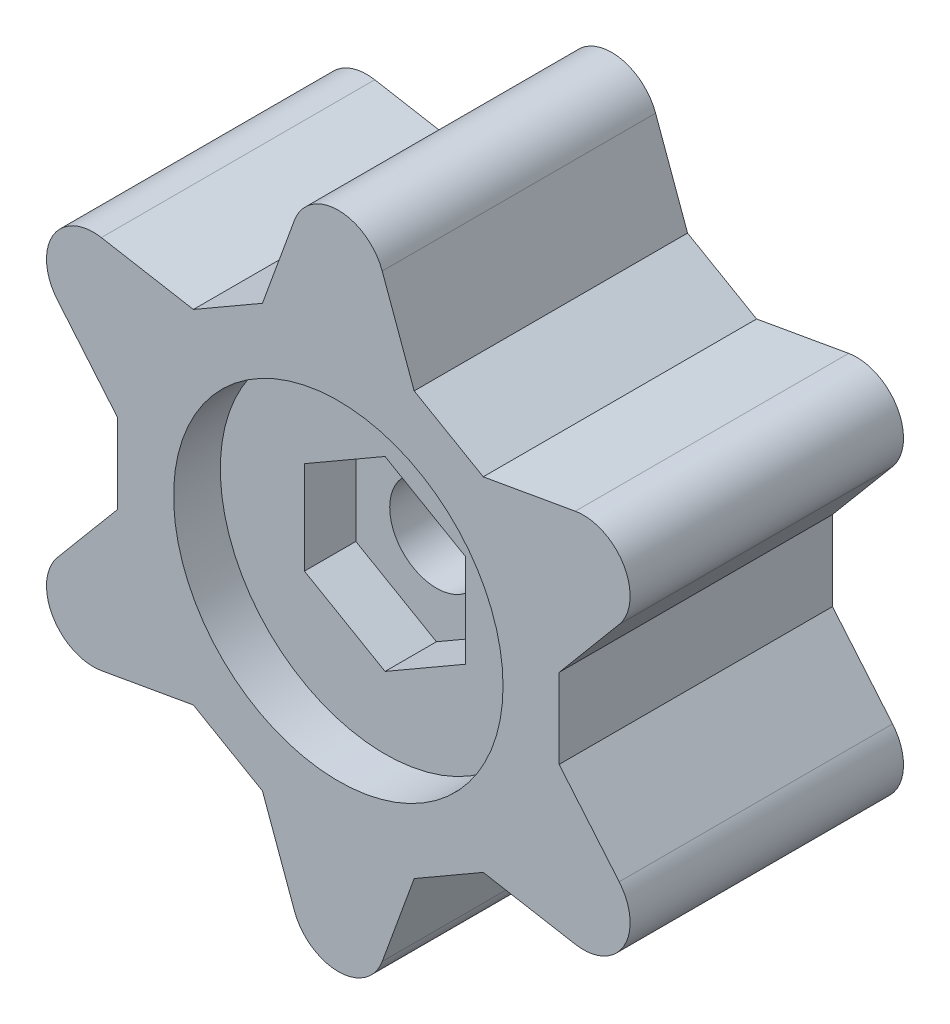
ISO-10303-21;
HEADER;
FILE_DESCRIPTION(('STEP AP214'),'2;1');
FILE_NAME('part.step','',(''),(''),'','','');
FILE_SCHEMA(('AUTOMOTIVE_DESIGN { 1 0 10303 214 1 1 1 1 }'));
ENDSEC;
DATA;
#1=APPLICATION_CONTEXT('core data for automotive mechanical design processes');
#2=APPLICATION_PROTOCOL_DEFINITION('international standard','automotive_design',2000,#1);
#3=PRODUCT_CONTEXT('',#1,'mechanical');
#4=PRODUCT('Part','Part','',(#3));
#5=PRODUCT_RELATED_PRODUCT_CATEGORY('part','',(#4));
#6=PRODUCT_DEFINITION_FORMATION('','',#4);
#7=PRODUCT_DEFINITION_CONTEXT('part definition',#1,'design');
#8=PRODUCT_DEFINITION('design','',#6,#7);
#9=PRODUCT_DEFINITION_SHAPE('','',#8);
#10=(LENGTH_UNIT() NAMED_UNIT(*) SI_UNIT(.MILLI.,.METRE.));
#11=(NAMED_UNIT(*) PLANE_ANGLE_UNIT() SI_UNIT($,.RADIAN.));
#12=(NAMED_UNIT(*) SI_UNIT($,.STERADIAN.) SOLID_ANGLE_UNIT());
#13=UNCERTAINTY_MEASURE_WITH_UNIT(LENGTH_MEASURE(1.E-05),#10,'distance_accuracy_value','');
#14=(GEOMETRIC_REPRESENTATION_CONTEXT(3) GLOBAL_UNCERTAINTY_ASSIGNED_CONTEXT((#13)) GLOBAL_UNIT_ASSIGNED_CONTEXT((#10,
#11,#12)) REPRESENTATION_CONTEXT('',''));
#15=CARTESIAN_POINT('',(0.,0.,0.));
#16=DIRECTION('',(0.,0.,1.));
#17=DIRECTION('',(1.,0.,0.));
#18=AXIS2_PLACEMENT_3D('',#15,#16,#17);
#19=CARTESIAN_POINT('',(0.,12.1117250217743,9.7));
#20=DIRECTION('',(0.,0.,-1.));
#21=DIRECTION('',(-1.,0.,0.));
#22=AXIS2_PLACEMENT_3D('',#19,#20,#21);
#23=PLANE('',#22);
#24=DIRECTION('',(0.866025403784439,0.5,0.));
#25=VECTOR('',#24,1.);
#26=CARTESIAN_POINT('',(0.,-3.98371685740842,9.7));
#27=LINE('',#26,#25);
#28=CARTESIAN_POINT('',(0.,-3.98371685740842,9.7));
#29=VERTEX_POINT('',#28);
#30=CARTESIAN_POINT('',(3.45,-1.99185842870421,9.7));
#31=VERTEX_POINT('',#30);
#32=EDGE_CURVE('E346',#29,#31,#27,.T.);
#33=ORIENTED_EDGE('',*,*,#32,.F.);
#34=DIRECTION('',(0.866025403784439,-0.5,0.));
#35=VECTOR('',#34,1.);
#36=CARTESIAN_POINT('',(-3.45,-1.99185842870421,9.7));
#37=LINE('',#36,#35);
#38=CARTESIAN_POINT('',(-3.45,-1.99185842870421,9.7));
#39=VERTEX_POINT('',#38);
#40=EDGE_CURVE('E357',#39,#29,#37,.T.);
#41=ORIENTED_EDGE('',*,*,#40,.F.);
#42=DIRECTION('',(0.,-1.,0.));
#43=VECTOR('',#42,1.);
#44=CARTESIAN_POINT('',(-3.45,1.99185842870421,9.7));
#45=LINE('',#44,#43);
#46=CARTESIAN_POINT('',(-3.45,1.99185842870421,9.7));
#47=VERTEX_POINT('',#46);
#48=EDGE_CURVE('E354',#47,#39,#45,.T.);
#49=ORIENTED_EDGE('',*,*,#48,.F.);
#50=DIRECTION('',(-0.866025403784439,-0.5,0.));
#51=VECTOR('',#50,1.);
#52=CARTESIAN_POINT('',(0.,3.98371685740842,9.7));
#53=LINE('',#52,#51);
#54=CARTESIAN_POINT('',(0.,3.98371685740842,9.7));
#55=VERTEX_POINT('',#54);
#56=EDGE_CURVE('E352',#55,#47,#53,.T.);
#57=ORIENTED_EDGE('',*,*,#56,.F.);
#58=DIRECTION('',(-0.866025403784439,0.5,0.));
#59=VECTOR('',#58,1.);
#60=CARTESIAN_POINT('',(3.45,1.99185842870421,9.7));
#61=LINE('',#60,#59);
#62=CARTESIAN_POINT('',(3.45,1.99185842870421,9.7));
#63=VERTEX_POINT('',#62);
#64=EDGE_CURVE('E350',#63,#55,#61,.T.);
#65=ORIENTED_EDGE('',*,*,#64,.F.);
#66=DIRECTION('',(0.,1.,0.));
#67=VECTOR('',#66,1.);
#68=CARTESIAN_POINT('',(3.45,-1.99185842870421,9.7));
#69=LINE('',#68,#67);
#70=EDGE_CURVE('E348',#31,#63,#69,.T.);
#71=ORIENTED_EDGE('',*,*,#70,.F.);
#72=EDGE_LOOP('',(#33,#41,#49,#57,#65,#71));
#73=FACE_BOUND('',#72,.T.);
#74=CARTESIAN_POINT('',(0.,0.,9.7));
#75=DIRECTION('',(0.,0.,1.));
#76=DIRECTION('',(1.,0.,0.));
#77=AXIS2_PLACEMENT_3D('',#74,#75,#76);
#78=CIRCLE('',#77,7.05);
#79=CARTESIAN_POINT('',(7.05,0.,9.7));
#80=VERTEX_POINT('',#79);
#81=EDGE_CURVE('E264',#80,#80,#78,.T.);
#82=ORIENTED_EDGE('',*,*,#81,.T.);
#83=EDGE_LOOP('',(#82));
#84=FACE_BOUND('',#83,.T.);
#85=ADVANCED_FACE('F35',(#73,#84),#23,.F.);
#86=CARTESIAN_POINT('',(0.,12.1117250217743,0.));
#87=DIRECTION('',(0.,0.,-1.));
#88=DIRECTION('',(-1.,0.,0.));
#89=AXIS2_PLACEMENT_3D('',#86,#87,#88);
#90=PLANE('',#89);
#91=DIRECTION('',(-0.866025403784439,-0.499999999999999,0.));
#92=VECTOR('',#91,1.);
#93=CARTESIAN_POINT('',(-6.20253418512551,7.33088530624386,0.));
#94=LINE('',#93,#92);
#95=CARTESIAN_POINT('',(-3.24746581487448,9.03699482528204,0.));
#96=VERTEX_POINT('',#95);
#97=CARTESIAN_POINT('',(-6.20253418512551,7.33088530624386,0.));
#98=VERTEX_POINT('',#97);
#99=EDGE_CURVE('E373',#96,#98,#94,.T.);
#100=ORIENTED_EDGE('',*,*,#99,.F.);
#101=DIRECTION('',(-0.342020143325666,-0.939692620785909,0.));
#102=VECTOR('',#101,1.);
#103=CARTESIAN_POINT('',(-3.24746581487448,9.03699482528204,0.));
#104=LINE('',#103,#102);
#105=CARTESIAN_POINT('',(-1.87938524157182,12.7957653084257,0.));
#106=VERTEX_POINT('',#105);
#107=EDGE_CURVE('E242',#106,#96,#104,.T.);
#108=ORIENTED_EDGE('',*,*,#107,.F.);
#109=CARTESIAN_POINT('',(0.,12.1117250217743,0.));
#110=DIRECTION('',(0.,0.,1.));
#111=DIRECTION('',(-1.,0.,0.));
#112=AXIS2_PLACEMENT_3D('',#109,#110,#111);
#113=CIRCLE('',#112,2.);
#114=CARTESIAN_POINT('',(1.87938524157182,12.7957653084257,0.));
#115=VERTEX_POINT('',#114);
#116=EDGE_CURVE('E417',#115,#106,#113,.T.);
#117=ORIENTED_EDGE('',*,*,#116,.F.);
#118=DIRECTION('',(-0.342020143325666,0.939692620785909,0.));
#119=VECTOR('',#118,1.);
#120=CARTESIAN_POINT('',(1.87938524157182,12.7957653084257,0.));
#121=LINE('',#120,#119);
#122=CARTESIAN_POINT('',(3.24746581487448,9.03699482528204,0.));
#123=VERTEX_POINT('',#122);
#124=EDGE_CURVE('E415',#123,#115,#121,.T.);
#125=ORIENTED_EDGE('',*,*,#124,.F.);
#126=DIRECTION('',(-0.866025403784439,0.5,0.));
#127=VECTOR('',#126,1.);
#128=CARTESIAN_POINT('',(3.24746581487448,9.03699482528204,0.));
#129=LINE('',#128,#127);
#130=CARTESIAN_POINT('',(6.20253418512552,7.33088530624386,0.));
#131=VERTEX_POINT('',#130);
#132=EDGE_CURVE('E413',#131,#123,#129,.T.);
#133=ORIENTED_EDGE('',*,*,#132,.F.);
#134=DIRECTION('',(-0.984807753012208,-0.173648177666933,0.));
#135=VECTOR('',#134,1.);
#136=CARTESIAN_POINT('',(6.20253418512552,7.33088530624386,0.));
#137=LINE('',#136,#135);
#138=CARTESIAN_POINT('',(10.1417651971744,8.02547801691159,0.));
#139=VERTEX_POINT('',#138);
#140=EDGE_CURVE('E411',#139,#131,#137,.T.);
#141=ORIENTED_EDGE('',*,*,#140,.F.);
#142=CARTESIAN_POINT('',(10.4890615525082,6.05586251088717,0.));
#143=DIRECTION('',(0.,0.,1.));
#144=DIRECTION('',(-1.,0.,0.));
#145=AXIS2_PLACEMENT_3D('',#142,#143,#144);
#146=CIRCLE('',#145,2.);
#147=CARTESIAN_POINT('',(12.0211504387462,4.77028729151409,0.));
#148=VERTEX_POINT('',#147);
#149=EDGE_CURVE('E409',#148,#139,#146,.T.);
#150=ORIENTED_EDGE('',*,*,#149,.F.);
#151=DIRECTION('',(0.642787609686542,0.766044443118976,0.));
#152=VECTOR('',#151,1.);
#153=CARTESIAN_POINT('',(12.0211504387462,4.77028729151409,0.));
#154=LINE('',#153,#152);
#155=CARTESIAN_POINT('',(9.45,1.70610951903819,0.));
#156=VERTEX_POINT('',#155);
#157=EDGE_CURVE('E407',#156,#148,#154,.T.);
#158=ORIENTED_EDGE('',*,*,#157,.F.);
#159=DIRECTION('',(0.,1.,0.));
#160=VECTOR('',#159,1.);
#161=CARTESIAN_POINT('',(9.45,1.70610951903819,0.));
#162=LINE('',#161,#160);
#163=CARTESIAN_POINT('',(9.45,-1.70610951903818,0.));
#164=VERTEX_POINT('',#163);
#165=EDGE_CURVE('E405',#164,#156,#162,.T.);
#166=ORIENTED_EDGE('',*,*,#165,.F.);
#167=DIRECTION('',(-0.642787609686541,0.766044443118977,0.));
#168=VECTOR('',#167,1.);
#169=CARTESIAN_POINT('',(9.45,-1.70610951903818,0.));
#170=LINE('',#169,#168);
#171=CARTESIAN_POINT('',(12.0211504387462,-4.77028729151409,0.));
#172=VERTEX_POINT('',#171);
#173=EDGE_CURVE('E403',#172,#164,#170,.T.);
#174=ORIENTED_EDGE('',*,*,#173,.F.);
#175=CARTESIAN_POINT('',(10.4890615525082,-6.05586251088718,0.));
#176=DIRECTION('',(0.,0.,1.));
#177=DIRECTION('',(-1.,0.,0.));
#178=AXIS2_PLACEMENT_3D('',#175,#176,#177);
#179=CIRCLE('',#178,2.);
#180=CARTESIAN_POINT('',(10.1417651971743,-8.02547801691159,0.));
#181=VERTEX_POINT('',#180);
#182=EDGE_CURVE('E401',#181,#172,#179,.T.);
#183=ORIENTED_EDGE('',*,*,#182,.F.);
#184=DIRECTION('',(0.984807753012207,-0.173648177666934,0.));
#185=VECTOR('',#184,1.);
#186=CARTESIAN_POINT('',(10.1417651971743,-8.02547801691159,0.));
#187=LINE('',#186,#185);
#188=CARTESIAN_POINT('',(6.20253418512552,-7.33088530624386,0.));
#189=VERTEX_POINT('',#188);
#190=EDGE_CURVE('E399',#189,#181,#187,.T.);
#191=ORIENTED_EDGE('',*,*,#190,.F.);
#192=DIRECTION('',(0.866025403784439,0.499999999999999,0.));
#193=VECTOR('',#192,1.);
#194=CARTESIAN_POINT('',(6.20253418512552,-7.33088530624386,0.));
#195=LINE('',#194,#193);
#196=CARTESIAN_POINT('',(3.24746581487448,-9.03699482528204,0.));
#197=VERTEX_POINT('',#196);
#198=EDGE_CURVE('E397',#197,#189,#195,.T.);
#199=ORIENTED_EDGE('',*,*,#198,.F.);
#200=DIRECTION('',(0.342020143325666,0.939692620785909,0.));
#201=VECTOR('',#200,1.);
#202=CARTESIAN_POINT('',(3.24746581487448,-9.03699482528204,0.));
#203=LINE('',#202,#201);
#204=CARTESIAN_POINT('',(1.87938524157181,-12.7957653084257,0.));
#205=VERTEX_POINT('',#204);
#206=EDGE_CURVE('E395',#205,#197,#203,.T.);
#207=ORIENTED_EDGE('',*,*,#206,.F.);
#208=CARTESIAN_POINT('',(0.,-12.1117250217743,0.));
#209=DIRECTION('',(0.,0.,1.));
#210=DIRECTION('',(-1.,0.,0.));
#211=AXIS2_PLACEMENT_3D('',#208,#209,#210);
#212=CIRCLE('',#211,2.);
#213=CARTESIAN_POINT('',(-1.87938524157183,-12.7957653084257,0.));
#214=VERTEX_POINT('',#213);
#215=EDGE_CURVE('E393',#214,#205,#212,.T.);
#216=ORIENTED_EDGE('',*,*,#215,.F.);
#217=DIRECTION('',(0.342020143325665,-0.93969262078591,0.));
#218=VECTOR('',#217,1.);
#219=CARTESIAN_POINT('',(-1.87938524157183,-12.7957653084257,0.));
#220=LINE('',#219,#218);
#221=CARTESIAN_POINT('',(-3.24746581487449,-9.03699482528204,0.));
#222=VERTEX_POINT('',#221);
#223=EDGE_CURVE('E391',#222,#214,#220,.T.);
#224=ORIENTED_EDGE('',*,*,#223,.F.);
#225=DIRECTION('',(0.866025403784438,-0.500000000000001,0.));
#226=VECTOR('',#225,1.);
#227=CARTESIAN_POINT('',(-3.24746581487449,-9.03699482528204,0.));
#228=LINE('',#227,#226);
#229=CARTESIAN_POINT('',(-6.20253418512552,-7.33088530624385,0.));
#230=VERTEX_POINT('',#229);
#231=EDGE_CURVE('E389',#230,#222,#228,.T.);
#232=ORIENTED_EDGE('',*,*,#231,.F.);
#233=DIRECTION('',(0.984807753012208,0.173648177666933,0.));
#234=VECTOR('',#233,1.);
#235=CARTESIAN_POINT('',(-6.20253418512552,-7.33088530624385,0.));
#236=LINE('',#235,#234);
#237=CARTESIAN_POINT('',(-10.1417651971744,-8.02547801691158,0.));
#238=VERTEX_POINT('',#237);
#239=EDGE_CURVE('E387',#238,#230,#236,.T.);
#240=ORIENTED_EDGE('',*,*,#239,.F.);
#241=CARTESIAN_POINT('',(-10.4890615525082,-6.05586251088717,0.));
#242=DIRECTION('',(0.,0.,1.));
#243=DIRECTION('',(-1.,0.,0.));
#244=AXIS2_PLACEMENT_3D('',#241,#242,#243);
#245=CIRCLE('',#244,2.);
#246=CARTESIAN_POINT('',(-12.0211504387462,-4.77028729151409,0.));
#247=VERTEX_POINT('',#246);
#248=EDGE_CURVE('E385',#247,#238,#245,.T.);
#249=ORIENTED_EDGE('',*,*,#248,.F.);
#250=DIRECTION('',(-0.642787609686543,-0.766044443118975,0.));
#251=VECTOR('',#250,1.);
#252=CARTESIAN_POINT('',(-12.0211504387462,-4.77028729151409,0.));
#253=LINE('',#252,#251);
#254=CARTESIAN_POINT('',(-9.45,-1.70610951903819,0.));
#255=VERTEX_POINT('',#254);
#256=EDGE_CURVE('E383',#255,#247,#253,.T.);
#257=ORIENTED_EDGE('',*,*,#256,.F.);
#258=DIRECTION('',(0.,-1.,0.));
#259=VECTOR('',#258,1.);
#260=CARTESIAN_POINT('',(-9.45,-1.70610951903819,0.));
#261=LINE('',#260,#259);
#262=CARTESIAN_POINT('',(-9.45,1.70610951903819,0.));
#263=VERTEX_POINT('',#262);
#264=EDGE_CURVE('E381',#263,#255,#261,.T.);
#265=ORIENTED_EDGE('',*,*,#264,.F.);
#266=DIRECTION('',(0.642787609686539,-0.766044443118978,0.));
#267=VECTOR('',#266,1.);
#268=CARTESIAN_POINT('',(-9.45,1.70610951903819,0.));
#269=LINE('',#268,#267);
#270=CARTESIAN_POINT('',(-12.0211504387462,4.7702872915141,0.));
#271=VERTEX_POINT('',#270);
#272=EDGE_CURVE('E379',#271,#263,#269,.T.);
#273=ORIENTED_EDGE('',*,*,#272,.F.);
#274=CARTESIAN_POINT('',(-10.4890615525082,6.05586251088719,0.));
#275=DIRECTION('',(0.,0.,1.));
#276=DIRECTION('',(-1.,0.,0.));
#277=AXIS2_PLACEMENT_3D('',#274,#275,#276);
#278=CIRCLE('',#277,2.);
#279=CARTESIAN_POINT('',(-10.1417651971743,8.0254780169116,0.));
#280=VERTEX_POINT('',#279);
#281=EDGE_CURVE('E377',#280,#271,#278,.T.);
#282=ORIENTED_EDGE('',*,*,#281,.F.);
#283=DIRECTION('',(-0.984807753012207,0.173648177666934,0.));
#284=VECTOR('',#283,1.);
#285=CARTESIAN_POINT('',(-10.1417651971743,8.0254780169116,0.));
#286=LINE('',#285,#284);
#287=EDGE_CURVE('E375',#98,#280,#286,.T.);
#288=ORIENTED_EDGE('',*,*,#287,.F.);
#289=EDGE_LOOP('',(#100,#108,#117,#125,#133,#141,#150,#158,#166,#174,#183,#191,#199,#207,#216,
#224,#232,#240,#249,#257,#265,#273,#282,#288));
#290=FACE_BOUND('',#289,.T.);
#291=CARTESIAN_POINT('',(0.,0.,0.));
#292=DIRECTION('',(0.,0.,-1.));
#293=DIRECTION('',(-1.,0.,0.));
#294=AXIS2_PLACEMENT_3D('',#291,#292,#293);
#295=CIRCLE('',#294,2.);
#296=CARTESIAN_POINT('',(-2.,0.,0.));
#297=VERTEX_POINT('',#296);
#298=EDGE_CURVE('E329',#297,#297,#295,.T.);
#299=ORIENTED_EDGE('',*,*,#298,.F.);
#300=EDGE_LOOP('',(#299));
#301=FACE_BOUND('',#300,.T.);
#302=ADVANCED_FACE('F488',(#290,#301),#90,.T.);
#303=CARTESIAN_POINT('',(-6.20253418512551,7.33088530624386,9.7));
#304=DIRECTION('',(0.499999999999999,-0.866025403784439,0.));
#305=DIRECTION('',(0.866025403784439,0.499999999999999,0.));
#306=AXIS2_PLACEMENT_3D('',#303,#304,#305);
#307=PLANE('',#306);
#308=ORIENTED_EDGE('',*,*,#99,.T.);
#309=DIRECTION('',(0.,0.,-1.));
#310=VECTOR('',#309,1.);
#311=CARTESIAN_POINT('',(-6.20253418512551,7.33088530624386,9.7));
#312=LINE('',#311,#310);
#313=CARTESIAN_POINT('',(-6.20253418512551,7.33088530624386,11.7));
#314=VERTEX_POINT('',#313);
#315=EDGE_CURVE('E11',#314,#98,#312,.T.);
#316=ORIENTED_EDGE('',*,*,#315,.F.);
#317=DIRECTION('',(-0.866025403784439,-0.499999999999999,0.));
#318=VECTOR('',#317,1.);
#319=CARTESIAN_POINT('',(-3.24746581487448,9.03699482528204,11.7));
#320=LINE('',#319,#318);
#321=CARTESIAN_POINT('',(-3.24746581487448,9.03699482528204,11.7));
#322=VERTEX_POINT('',#321);
#323=EDGE_CURVE('E249',#322,#314,#320,.T.);
#324=ORIENTED_EDGE('',*,*,#323,.F.);
#325=DIRECTION('',(0.,0.,-1.));
#326=VECTOR('',#325,1.);
#327=CARTESIAN_POINT('',(-3.24746581487448,9.03699482528204,9.7));
#328=LINE('',#327,#326);
#329=EDGE_CURVE('E235',#322,#96,#328,.T.);
#330=ORIENTED_EDGE('',*,*,#329,.T.);
#331=EDGE_LOOP('',(#308,#316,#324,#330));
#332=FACE_BOUND('',#331,.T.);
#333=ADVANCED_FACE('F37',(#332),#307,.F.);
#334=CARTESIAN_POINT('',(-10.1417651971743,8.0254780169116,9.7));
#335=DIRECTION('',(-0.173648177666934,-0.984807753012207,0.));
#336=DIRECTION('',(0.984807753012207,-0.173648177666934,0.));
#337=AXIS2_PLACEMENT_3D('',#334,#335,#336);
#338=PLANE('',#337);
#339=ORIENTED_EDGE('',*,*,#287,.T.);
#340=DIRECTION('',(0.,0.,-1.));
#341=VECTOR('',#340,1.);
#342=CARTESIAN_POINT('',(-10.1417651971743,8.0254780169116,9.7));
#343=LINE('',#342,#341);
#344=CARTESIAN_POINT('',(-10.1417651971743,8.0254780169116,11.7));
#345=VERTEX_POINT('',#344);
#346=EDGE_CURVE('E43',#345,#280,#343,.T.);
#347=ORIENTED_EDGE('',*,*,#346,.F.);
#348=DIRECTION('',(-0.984807753012207,0.173648177666934,0.));
#349=VECTOR('',#348,1.);
#350=CARTESIAN_POINT('',(-6.20253418512551,7.33088530624386,11.7));
#351=LINE('',#350,#349);
#352=EDGE_CURVE('E253',#314,#345,#351,.T.);
#353=ORIENTED_EDGE('',*,*,#352,.F.);
#354=ORIENTED_EDGE('',*,*,#315,.T.);
#355=EDGE_LOOP('',(#339,#347,#353,#354));
#356=FACE_BOUND('',#355,.T.);
#357=ADVANCED_FACE('F852',(#356),#338,.F.);
#358=CARTESIAN_POINT('',(-10.4890615525082,6.05586251088719,9.7));
#359=DIRECTION('',(0.,0.,-1.));
#360=DIRECTION('',(-1.,0.,0.));
#361=AXIS2_PLACEMENT_3D('',#358,#359,#360);
#362=CYLINDRICAL_SURFACE('',#361,2.);
#363=ORIENTED_EDGE('',*,*,#281,.T.);
#364=DIRECTION('',(0.,0.,-1.));
#365=VECTOR('',#364,1.);
#366=CARTESIAN_POINT('',(-12.0211504387462,4.7702872915141,9.7));
#367=LINE('',#366,#365);
#368=CARTESIAN_POINT('',(-12.0211504387462,4.77028729151411,11.7));
#369=VERTEX_POINT('',#368);
#370=EDGE_CURVE('E478',#369,#271,#367,.T.);
#371=ORIENTED_EDGE('',*,*,#370,.F.);
#372=CARTESIAN_POINT('',(-10.4890615525082,6.05586251088719,11.7));
#373=DIRECTION('',(0.,0.,1.));
#374=DIRECTION('',(1.,0.,0.));
#375=AXIS2_PLACEMENT_3D('',#372,#373,#374);
#376=CIRCLE('',#375,2.);
#377=EDGE_CURVE('E269',#345,#369,#376,.T.);
#378=ORIENTED_EDGE('',*,*,#377,.F.);
#379=ORIENTED_EDGE('',*,*,#346,.T.);
#380=EDGE_LOOP('',(#363,#371,#378,#379));
#381=FACE_BOUND('',#380,.T.);
#382=ADVANCED_FACE('F484',(#381),#362,.T.);
#383=CARTESIAN_POINT('',(-9.45,1.70610951903819,9.7));
#384=DIRECTION('',(0.766044443118978,0.642787609686539,0.));
#385=DIRECTION('',(-0.642787609686539,0.766044443118978,0.));
#386=AXIS2_PLACEMENT_3D('',#383,#384,#385);
#387=PLANE('',#386);
#388=ORIENTED_EDGE('',*,*,#272,.T.);
#389=DIRECTION('',(0.,0.,-1.));
#390=VECTOR('',#389,1.);
#391=CARTESIAN_POINT('',(-9.45,1.70610951903819,9.7));
#392=LINE('',#391,#390);
#393=CARTESIAN_POINT('',(-9.45,1.70610951903819,11.7));
#394=VERTEX_POINT('',#393);
#395=EDGE_CURVE('E475',#394,#263,#392,.T.);
#396=ORIENTED_EDGE('',*,*,#395,.F.);
#397=DIRECTION('',(0.642787609686539,-0.766044443118978,0.));
#398=VECTOR('',#397,1.);
#399=CARTESIAN_POINT('',(-12.0211504387462,4.77028729151411,11.7));
#400=LINE('',#399,#398);
#401=EDGE_CURVE('E272',#369,#394,#400,.T.);
#402=ORIENTED_EDGE('',*,*,#401,.F.);
#403=ORIENTED_EDGE('',*,*,#370,.T.);
#404=EDGE_LOOP('',(#388,#396,#402,#403));
#405=FACE_BOUND('',#404,.T.);
#406=ADVANCED_FACE('F493',(#405),#387,.F.);
#407=CARTESIAN_POINT('',(-9.45,-1.70610951903819,9.7));
#408=DIRECTION('',(1.,0.,0.));
#409=DIRECTION('',(0.,0.,-1.));
#410=AXIS2_PLACEMENT_3D('',#407,#408,#409);
#411=PLANE('',#410);
#412=ORIENTED_EDGE('',*,*,#264,.T.);
#413=DIRECTION('',(0.,0.,-1.));
#414=VECTOR('',#413,1.);
#415=CARTESIAN_POINT('',(-9.45,-1.70610951903819,9.7));
#416=LINE('',#415,#414);
#417=CARTESIAN_POINT('',(-9.45,-1.70610951903819,11.7));
#418=VERTEX_POINT('',#417);
#419=EDGE_CURVE('E472',#418,#255,#416,.T.);
#420=ORIENTED_EDGE('',*,*,#419,.F.);
#421=DIRECTION('',(0.,-1.,0.));
#422=VECTOR('',#421,1.);
#423=CARTESIAN_POINT('',(-9.45,1.70610951903819,11.7));
#424=LINE('',#423,#422);
#425=EDGE_CURVE('E275',#394,#418,#424,.T.);
#426=ORIENTED_EDGE('',*,*,#425,.F.);
#427=ORIENTED_EDGE('',*,*,#395,.T.);
#428=EDGE_LOOP('',(#412,#420,#426,#427));
#429=FACE_BOUND('',#428,.T.);
#430=ADVANCED_FACE('F497',(#429),#411,.F.);
#431=CARTESIAN_POINT('',(-12.0211504387462,-4.77028729151409,9.7));
#432=DIRECTION('',(0.766044443118975,-0.642787609686543,0.));
#433=DIRECTION('',(0.642787609686543,0.766044443118975,0.));
#434=AXIS2_PLACEMENT_3D('',#431,#432,#433);
#435=PLANE('',#434);
#436=ORIENTED_EDGE('',*,*,#256,.T.);
#437=DIRECTION('',(0.,0.,-1.));
#438=VECTOR('',#437,1.);
#439=CARTESIAN_POINT('',(-12.0211504387462,-4.77028729151409,9.7));
#440=LINE('',#439,#438);
#441=CARTESIAN_POINT('',(-12.0211504387462,-4.77028729151409,11.7));
#442=VERTEX_POINT('',#441);
#443=EDGE_CURVE('E469',#442,#247,#440,.T.);
#444=ORIENTED_EDGE('',*,*,#443,.F.);
#445=DIRECTION('',(-0.642787609686543,-0.766044443118975,0.));
#446=VECTOR('',#445,1.);
#447=CARTESIAN_POINT('',(-9.45,-1.70610951903819,11.7));
#448=LINE('',#447,#446);
#449=EDGE_CURVE('E278',#418,#442,#448,.T.);
#450=ORIENTED_EDGE('',*,*,#449,.F.);
#451=ORIENTED_EDGE('',*,*,#419,.T.);
#452=EDGE_LOOP('',(#436,#444,#450,#451));
#453=FACE_BOUND('',#452,.T.);
#454=ADVANCED_FACE('F501',(#453),#435,.F.);
#455=CARTESIAN_POINT('',(-10.4890615525082,-6.05586251088717,9.7));
#456=DIRECTION('',(0.,0.,-1.));
#457=DIRECTION('',(-1.,0.,0.));
#458=AXIS2_PLACEMENT_3D('',#455,#456,#457);
#459=CYLINDRICAL_SURFACE('',#458,2.);
#460=ORIENTED_EDGE('',*,*,#248,.T.);
#461=DIRECTION('',(0.,0.,-1.));
#462=VECTOR('',#461,1.);
#463=CARTESIAN_POINT('',(-10.1417651971744,-8.02547801691158,9.7));
#464=LINE('',#463,#462);
#465=CARTESIAN_POINT('',(-10.1417651971744,-8.02547801691158,11.7));
#466=VERTEX_POINT('',#465);
#467=EDGE_CURVE('E466',#466,#238,#464,.T.);
#468=ORIENTED_EDGE('',*,*,#467,.F.);
#469=CARTESIAN_POINT('',(-10.4890615525082,-6.05586251088717,11.7));
#470=DIRECTION('',(0.,0.,1.));
#471=DIRECTION('',(1.,0.,0.));
#472=AXIS2_PLACEMENT_3D('',#469,#470,#471);
#473=CIRCLE('',#472,2.);
#474=EDGE_CURVE('E281',#442,#466,#473,.T.);
#475=ORIENTED_EDGE('',*,*,#474,.F.);
#476=ORIENTED_EDGE('',*,*,#443,.T.);
#477=EDGE_LOOP('',(#460,#468,#475,#476));
#478=FACE_BOUND('',#477,.T.);
#479=ADVANCED_FACE('F504',(#478),#459,.T.);
#480=CARTESIAN_POINT('',(-6.20253418512552,-7.33088530624385,9.7));
#481=DIRECTION('',(-0.173648177666933,0.984807753012208,0.));
#482=DIRECTION('',(-0.984807753012208,-0.173648177666933,0.));
#483=AXIS2_PLACEMENT_3D('',#480,#481,#482);
#484=PLANE('',#483);
#485=ORIENTED_EDGE('',*,*,#239,.T.);
#486=DIRECTION('',(0.,0.,-1.));
#487=VECTOR('',#486,1.);
#488=CARTESIAN_POINT('',(-6.20253418512552,-7.33088530624385,9.7));
#489=LINE('',#488,#487);
#490=CARTESIAN_POINT('',(-6.20253418512552,-7.33088530624385,11.7));
#491=VERTEX_POINT('',#490);
#492=EDGE_CURVE('E463',#491,#230,#489,.T.);
#493=ORIENTED_EDGE('',*,*,#492,.F.);
#494=DIRECTION('',(0.984807753012208,0.173648177666933,0.));
#495=VECTOR('',#494,1.);
#496=CARTESIAN_POINT('',(-10.1417651971744,-8.02547801691158,11.7));
#497=LINE('',#496,#495);
#498=EDGE_CURVE('E284',#466,#491,#497,.T.);
#499=ORIENTED_EDGE('',*,*,#498,.F.);
#500=ORIENTED_EDGE('',*,*,#467,.T.);
#501=EDGE_LOOP('',(#485,#493,#499,#500));
#502=FACE_BOUND('',#501,.T.);
#503=ADVANCED_FACE('F509',(#502),#484,.F.);
#504=CARTESIAN_POINT('',(-3.24746581487449,-9.03699482528204,9.7));
#505=DIRECTION('',(0.500000000000001,0.866025403784438,0.));
#506=DIRECTION('',(-0.866025403784438,0.500000000000001,0.));
#507=AXIS2_PLACEMENT_3D('',#504,#505,#506);
#508=PLANE('',#507);
#509=ORIENTED_EDGE('',*,*,#231,.T.);
#510=DIRECTION('',(0.,0.,-1.));
#511=VECTOR('',#510,1.);
#512=CARTESIAN_POINT('',(-3.24746581487449,-9.03699482528204,9.7));
#513=LINE('',#512,#511);
#514=CARTESIAN_POINT('',(-3.24746581487449,-9.03699482528204,11.7));
#515=VERTEX_POINT('',#514);
#516=EDGE_CURVE('E460',#515,#222,#513,.T.);
#517=ORIENTED_EDGE('',*,*,#516,.F.);
#518=DIRECTION('',(0.866025403784438,-0.500000000000001,0.));
#519=VECTOR('',#518,1.);
#520=CARTESIAN_POINT('',(-6.20253418512552,-7.33088530624385,11.7));
#521=LINE('',#520,#519);
#522=EDGE_CURVE('E287',#491,#515,#521,.T.);
#523=ORIENTED_EDGE('',*,*,#522,.F.);
#524=ORIENTED_EDGE('',*,*,#492,.T.);
#525=EDGE_LOOP('',(#509,#517,#523,#524));
#526=FACE_BOUND('',#525,.T.);
#527=ADVANCED_FACE('F513',(#526),#508,.F.);
#528=CARTESIAN_POINT('',(-1.87938524157183,-12.7957653084257,9.7));
#529=DIRECTION('',(0.93969262078591,0.342020143325665,0.));
#530=DIRECTION('',(-0.342020143325665,0.93969262078591,0.));
#531=AXIS2_PLACEMENT_3D('',#528,#529,#530);
#532=PLANE('',#531);
#533=ORIENTED_EDGE('',*,*,#223,.T.);
#534=DIRECTION('',(0.,0.,-1.));
#535=VECTOR('',#534,1.);
#536=CARTESIAN_POINT('',(-1.87938524157183,-12.7957653084257,9.7));
#537=LINE('',#536,#535);
#538=CARTESIAN_POINT('',(-1.87938524157183,-12.7957653084257,11.7));
#539=VERTEX_POINT('',#538);
#540=EDGE_CURVE('E457',#539,#214,#537,.T.);
#541=ORIENTED_EDGE('',*,*,#540,.F.);
#542=DIRECTION('',(0.342020143325665,-0.93969262078591,0.));
#543=VECTOR('',#542,1.);
#544=CARTESIAN_POINT('',(-3.24746581487449,-9.03699482528204,11.7));
#545=LINE('',#544,#543);
#546=EDGE_CURVE('E290',#515,#539,#545,.T.);
#547=ORIENTED_EDGE('',*,*,#546,.F.);
#548=ORIENTED_EDGE('',*,*,#516,.T.);
#549=EDGE_LOOP('',(#533,#541,#547,#548));
#550=FACE_BOUND('',#549,.T.);
#551=ADVANCED_FACE('F517',(#550),#532,.F.);
#552=CARTESIAN_POINT('',(0.,-12.1117250217743,9.7));
#553=DIRECTION('',(0.,0.,-1.));
#554=DIRECTION('',(-1.,0.,0.));
#555=AXIS2_PLACEMENT_3D('',#552,#553,#554);
#556=CYLINDRICAL_SURFACE('',#555,2.);
#557=ORIENTED_EDGE('',*,*,#215,.T.);
#558=DIRECTION('',(0.,0.,-1.));
#559=VECTOR('',#558,1.);
#560=CARTESIAN_POINT('',(1.87938524157181,-12.7957653084257,9.7));
#561=LINE('',#560,#559);
#562=CARTESIAN_POINT('',(1.87938524157181,-12.7957653084257,11.7));
#563=VERTEX_POINT('',#562);
#564=EDGE_CURVE('E454',#563,#205,#561,.T.);
#565=ORIENTED_EDGE('',*,*,#564,.F.);
#566=CARTESIAN_POINT('',(0.,-12.1117250217743,11.7));
#567=DIRECTION('',(0.,0.,1.));
#568=DIRECTION('',(1.,0.,0.));
#569=AXIS2_PLACEMENT_3D('',#566,#567,#568);
#570=CIRCLE('',#569,2.);
#571=EDGE_CURVE('E293',#539,#563,#570,.T.);
#572=ORIENTED_EDGE('',*,*,#571,.F.);
#573=ORIENTED_EDGE('',*,*,#540,.T.);
#574=EDGE_LOOP('',(#557,#565,#572,#573));
#575=FACE_BOUND('',#574,.T.);
#576=ADVANCED_FACE('F520',(#575),#556,.T.);
#577=CARTESIAN_POINT('',(3.24746581487448,-9.03699482528204,9.7));
#578=DIRECTION('',(-0.939692620785909,0.342020143325666,0.));
#579=DIRECTION('',(-0.342020143325666,-0.939692620785909,0.));
#580=AXIS2_PLACEMENT_3D('',#577,#578,#579);
#581=PLANE('',#580);
#582=ORIENTED_EDGE('',*,*,#206,.T.);
#583=DIRECTION('',(0.,0.,-1.));
#584=VECTOR('',#583,1.);
#585=CARTESIAN_POINT('',(3.24746581487448,-9.03699482528204,9.7));
#586=LINE('',#585,#584);
#587=CARTESIAN_POINT('',(3.24746581487448,-9.03699482528204,11.7));
#588=VERTEX_POINT('',#587);
#589=EDGE_CURVE('E451',#588,#197,#586,.T.);
#590=ORIENTED_EDGE('',*,*,#589,.F.);
#591=DIRECTION('',(0.342020143325666,0.939692620785909,0.));
#592=VECTOR('',#591,1.);
#593=CARTESIAN_POINT('',(1.87938524157181,-12.7957653084257,11.7));
#594=LINE('',#593,#592);
#595=EDGE_CURVE('E296',#563,#588,#594,.T.);
#596=ORIENTED_EDGE('',*,*,#595,.F.);
#597=ORIENTED_EDGE('',*,*,#564,.T.);
#598=EDGE_LOOP('',(#582,#590,#596,#597));
#599=FACE_BOUND('',#598,.T.);
#600=ADVANCED_FACE('F525',(#599),#581,.F.);
#601=CARTESIAN_POINT('',(6.20253418512552,-7.33088530624386,9.7));
#602=DIRECTION('',(-0.499999999999999,0.866025403784439,0.));
#603=DIRECTION('',(-0.866025403784439,-0.499999999999999,0.));
#604=AXIS2_PLACEMENT_3D('',#601,#602,#603);
#605=PLANE('',#604);
#606=ORIENTED_EDGE('',*,*,#198,.T.);
#607=DIRECTION('',(0.,0.,-1.));
#608=VECTOR('',#607,1.);
#609=CARTESIAN_POINT('',(6.20253418512552,-7.33088530624386,9.7));
#610=LINE('',#609,#608);
#611=CARTESIAN_POINT('',(6.20253418512552,-7.33088530624386,11.7));
#612=VERTEX_POINT('',#611);
#613=EDGE_CURVE('E448',#612,#189,#610,.T.);
#614=ORIENTED_EDGE('',*,*,#613,.F.);
#615=DIRECTION('',(0.866025403784439,0.499999999999999,0.));
#616=VECTOR('',#615,1.);
#617=CARTESIAN_POINT('',(3.24746581487448,-9.03699482528204,11.7));
#618=LINE('',#617,#616);
#619=EDGE_CURVE('E299',#588,#612,#618,.T.);
#620=ORIENTED_EDGE('',*,*,#619,.F.);
#621=ORIENTED_EDGE('',*,*,#589,.T.);
#622=EDGE_LOOP('',(#606,#614,#620,#621));
#623=FACE_BOUND('',#622,.T.);
#624=ADVANCED_FACE('F529',(#623),#605,.F.);
#625=CARTESIAN_POINT('',(10.1417651971743,-8.02547801691159,9.7));
#626=DIRECTION('',(0.173648177666934,0.984807753012208,0.));
#627=DIRECTION('',(-0.984807753012208,0.173648177666934,0.));
#628=AXIS2_PLACEMENT_3D('',#625,#626,#627);
#629=PLANE('',#628);
#630=ORIENTED_EDGE('',*,*,#190,.T.);
#631=DIRECTION('',(0.,0.,-1.));
#632=VECTOR('',#631,1.);
#633=CARTESIAN_POINT('',(10.1417651971743,-8.02547801691159,9.7));
#634=LINE('',#633,#632);
#635=CARTESIAN_POINT('',(10.1417651971743,-8.02547801691159,11.7));
#636=VERTEX_POINT('',#635);
#637=EDGE_CURVE('E445',#636,#181,#634,.T.);
#638=ORIENTED_EDGE('',*,*,#637,.F.);
#639=DIRECTION('',(0.984807753012207,-0.173648177666934,0.));
#640=VECTOR('',#639,1.);
#641=CARTESIAN_POINT('',(6.20253418512552,-7.33088530624386,11.7));
#642=LINE('',#641,#640);
#643=EDGE_CURVE('E302',#612,#636,#642,.T.);
#644=ORIENTED_EDGE('',*,*,#643,.F.);
#645=ORIENTED_EDGE('',*,*,#613,.T.);
#646=EDGE_LOOP('',(#630,#638,#644,#645));
#647=FACE_BOUND('',#646,.T.);
#648=ADVANCED_FACE('F533',(#647),#629,.F.);
#649=CARTESIAN_POINT('',(10.4890615525082,-6.05586251088718,9.7));
#650=DIRECTION('',(0.,0.,-1.));
#651=DIRECTION('',(-1.,0.,0.));
#652=AXIS2_PLACEMENT_3D('',#649,#650,#651);
#653=CYLINDRICAL_SURFACE('',#652,2.);
#654=ORIENTED_EDGE('',*,*,#182,.T.);
#655=DIRECTION('',(0.,0.,-1.));
#656=VECTOR('',#655,1.);
#657=CARTESIAN_POINT('',(12.0211504387462,-4.77028729151409,9.7));
#658=LINE('',#657,#656);
#659=CARTESIAN_POINT('',(12.0211504387462,-4.77028729151409,11.7));
#660=VERTEX_POINT('',#659);
#661=EDGE_CURVE('E442',#660,#172,#658,.T.);
#662=ORIENTED_EDGE('',*,*,#661,.F.);
#663=CARTESIAN_POINT('',(10.4890615525082,-6.05586251088718,11.7));
#664=DIRECTION('',(0.,0.,1.));
#665=DIRECTION('',(1.,0.,0.));
#666=AXIS2_PLACEMENT_3D('',#663,#664,#665);
#667=CIRCLE('',#666,2.);
#668=EDGE_CURVE('E305',#636,#660,#667,.T.);
#669=ORIENTED_EDGE('',*,*,#668,.F.);
#670=ORIENTED_EDGE('',*,*,#637,.T.);
#671=EDGE_LOOP('',(#654,#662,#669,#670));
#672=FACE_BOUND('',#671,.T.);
#673=ADVANCED_FACE('F536',(#672),#653,.T.);
#674=CARTESIAN_POINT('',(9.45,-1.70610951903818,9.7));
#675=DIRECTION('',(-0.766044443118977,-0.642787609686541,0.));
#676=DIRECTION('',(0.642787609686541,-0.766044443118976,0.));
#677=AXIS2_PLACEMENT_3D('',#674,#675,#676);
#678=PLANE('',#677);
#679=ORIENTED_EDGE('',*,*,#173,.T.);
#680=DIRECTION('',(0.,0.,-1.));
#681=VECTOR('',#680,1.);
#682=CARTESIAN_POINT('',(9.45,-1.70610951903818,9.7));
#683=LINE('',#682,#681);
#684=CARTESIAN_POINT('',(9.45,-1.70610951903818,11.7));
#685=VERTEX_POINT('',#684);
#686=EDGE_CURVE('E439',#685,#164,#683,.T.);
#687=ORIENTED_EDGE('',*,*,#686,.F.);
#688=DIRECTION('',(-0.642787609686541,0.766044443118977,0.));
#689=VECTOR('',#688,1.);
#690=CARTESIAN_POINT('',(12.0211504387462,-4.77028729151409,11.7));
#691=LINE('',#690,#689);
#692=EDGE_CURVE('E308',#660,#685,#691,.T.);
#693=ORIENTED_EDGE('',*,*,#692,.F.);
#694=ORIENTED_EDGE('',*,*,#661,.T.);
#695=EDGE_LOOP('',(#679,#687,#693,#694));
#696=FACE_BOUND('',#695,.T.);
#697=ADVANCED_FACE('F541',(#696),#678,.F.);
#698=CARTESIAN_POINT('',(9.45,1.70610951903819,9.7));
#699=DIRECTION('',(-1.,0.,0.));
#700=DIRECTION('',(0.,0.,1.));
#701=AXIS2_PLACEMENT_3D('',#698,#699,#700);
#702=PLANE('',#701);
#703=ORIENTED_EDGE('',*,*,#165,.T.);
#704=DIRECTION('',(0.,0.,-1.));
#705=VECTOR('',#704,1.);
#706=CARTESIAN_POINT('',(9.45,1.70610951903819,9.7));
#707=LINE('',#706,#705);
#708=CARTESIAN_POINT('',(9.45,1.70610951903819,11.7));
#709=VERTEX_POINT('',#708);
#710=EDGE_CURVE('E436',#709,#156,#707,.T.);
#711=ORIENTED_EDGE('',*,*,#710,.F.);
#712=DIRECTION('',(0.,1.,0.));
#713=VECTOR('',#712,1.);
#714=CARTESIAN_POINT('',(9.45,-1.70610951903818,11.7));
#715=LINE('',#714,#713);
#716=EDGE_CURVE('E311',#685,#709,#715,.T.);
#717=ORIENTED_EDGE('',*,*,#716,.F.);
#718=ORIENTED_EDGE('',*,*,#686,.T.);
#719=EDGE_LOOP('',(#703,#711,#717,#718));
#720=FACE_BOUND('',#719,.T.);
#721=ADVANCED_FACE('F545',(#720),#702,.F.);
#722=CARTESIAN_POINT('',(12.0211504387462,4.77028729151409,9.7));
#723=DIRECTION('',(-0.766044443118976,0.642787609686542,0.));
#724=DIRECTION('',(-0.642787609686542,-0.766044443118976,0.));
#725=AXIS2_PLACEMENT_3D('',#722,#723,#724);
#726=PLANE('',#725);
#727=ORIENTED_EDGE('',*,*,#157,.T.);
#728=DIRECTION('',(0.,0.,-1.));
#729=VECTOR('',#728,1.);
#730=CARTESIAN_POINT('',(12.0211504387462,4.77028729151409,9.7));
#731=LINE('',#730,#729);
#732=CARTESIAN_POINT('',(12.0211504387462,4.77028729151409,11.7));
#733=VERTEX_POINT('',#732);
#734=EDGE_CURVE('E433',#733,#148,#731,.T.);
#735=ORIENTED_EDGE('',*,*,#734,.F.);
#736=DIRECTION('',(0.642787609686543,0.766044443118975,0.));
#737=VECTOR('',#736,1.);
#738=CARTESIAN_POINT('',(9.45,1.70610951903819,11.7));
#739=LINE('',#738,#737);
#740=EDGE_CURVE('E314',#709,#733,#739,.T.);
#741=ORIENTED_EDGE('',*,*,#740,.F.);
#742=ORIENTED_EDGE('',*,*,#710,.T.);
#743=EDGE_LOOP('',(#727,#735,#741,#742));
#744=FACE_BOUND('',#743,.T.);
#745=ADVANCED_FACE('F549',(#744),#726,.F.);
#746=CARTESIAN_POINT('',(10.4890615525082,6.05586251088717,9.7));
#747=DIRECTION('',(0.,0.,-1.));
#748=DIRECTION('',(-1.,0.,0.));
#749=AXIS2_PLACEMENT_3D('',#746,#747,#748);
#750=CYLINDRICAL_SURFACE('',#749,2.);
#751=ORIENTED_EDGE('',*,*,#149,.T.);
#752=DIRECTION('',(0.,0.,-1.));
#753=VECTOR('',#752,1.);
#754=CARTESIAN_POINT('',(10.1417651971744,8.02547801691159,9.7));
#755=LINE('',#754,#753);
#756=CARTESIAN_POINT('',(10.1417651971744,8.02547801691158,11.7));
#757=VERTEX_POINT('',#756);
#758=EDGE_CURVE('E430',#757,#139,#755,.T.);
#759=ORIENTED_EDGE('',*,*,#758,.F.);
#760=CARTESIAN_POINT('',(10.4890615525082,6.05586251088717,11.7));
#761=DIRECTION('',(0.,0.,1.));
#762=DIRECTION('',(1.,0.,0.));
#763=AXIS2_PLACEMENT_3D('',#760,#761,#762);
#764=CIRCLE('',#763,2.);
#765=EDGE_CURVE('E317',#733,#757,#764,.T.);
#766=ORIENTED_EDGE('',*,*,#765,.F.);
#767=ORIENTED_EDGE('',*,*,#734,.T.);
#768=EDGE_LOOP('',(#751,#759,#766,#767));
#769=FACE_BOUND('',#768,.T.);
#770=ADVANCED_FACE('F552',(#769),#750,.T.);
#771=CARTESIAN_POINT('',(6.20253418512552,7.33088530624386,9.7));
#772=DIRECTION('',(0.173648177666933,-0.984807753012208,0.));
#773=DIRECTION('',(0.984807753012208,0.173648177666933,0.));
#774=AXIS2_PLACEMENT_3D('',#771,#772,#773);
#775=PLANE('',#774);
#776=ORIENTED_EDGE('',*,*,#140,.T.);
#777=DIRECTION('',(0.,0.,-1.));
#778=VECTOR('',#777,1.);
#779=CARTESIAN_POINT('',(6.20253418512552,7.33088530624386,9.7));
#780=LINE('',#779,#778);
#781=CARTESIAN_POINT('',(6.20253418512552,7.33088530624386,11.7));
#782=VERTEX_POINT('',#781);
#783=EDGE_CURVE('E427',#782,#131,#780,.T.);
#784=ORIENTED_EDGE('',*,*,#783,.F.);
#785=DIRECTION('',(-0.984807753012208,-0.173648177666932,0.));
#786=VECTOR('',#785,1.);
#787=CARTESIAN_POINT('',(10.1417651971744,8.02547801691159,11.7));
#788=LINE('',#787,#786);
#789=EDGE_CURVE('E320',#757,#782,#788,.T.);
#790=ORIENTED_EDGE('',*,*,#789,.F.);
#791=ORIENTED_EDGE('',*,*,#758,.T.);
#792=EDGE_LOOP('',(#776,#784,#790,#791));
#793=FACE_BOUND('',#792,.T.);
#794=ADVANCED_FACE('F557',(#793),#775,.F.);
#795=CARTESIAN_POINT('',(3.24746581487448,9.03699482528204,9.7));
#796=DIRECTION('',(-0.5,-0.866025403784439,0.));
#797=DIRECTION('',(0.866025403784439,-0.5,0.));
#798=AXIS2_PLACEMENT_3D('',#795,#796,#797);
#799=PLANE('',#798);
#800=ORIENTED_EDGE('',*,*,#132,.T.);
#801=DIRECTION('',(0.,0.,-1.));
#802=VECTOR('',#801,1.);
#803=CARTESIAN_POINT('',(3.24746581487448,9.03699482528204,9.7));
#804=LINE('',#803,#802);
#805=CARTESIAN_POINT('',(3.24746581487448,9.03699482528204,11.7));
#806=VERTEX_POINT('',#805);
#807=EDGE_CURVE('E424',#806,#123,#804,.T.);
#808=ORIENTED_EDGE('',*,*,#807,.F.);
#809=DIRECTION('',(-0.866025403784439,0.5,0.));
#810=VECTOR('',#809,1.);
#811=CARTESIAN_POINT('',(6.20253418512552,7.33088530624386,11.7));
#812=LINE('',#811,#810);
#813=EDGE_CURVE('E323',#782,#806,#812,.T.);
#814=ORIENTED_EDGE('',*,*,#813,.F.);
#815=ORIENTED_EDGE('',*,*,#783,.T.);
#816=EDGE_LOOP('',(#800,#808,#814,#815));
#817=FACE_BOUND('',#816,.T.);
#818=ADVANCED_FACE('F561',(#817),#799,.F.);
#819=CARTESIAN_POINT('',(1.87938524157182,12.7957653084257,9.7));
#820=DIRECTION('',(-0.93969262078591,-0.342020143325666,0.));
#821=DIRECTION('',(0.342020143325666,-0.93969262078591,0.));
#822=AXIS2_PLACEMENT_3D('',#819,#820,#821);
#823=PLANE('',#822);
#824=ORIENTED_EDGE('',*,*,#124,.T.);
#825=DIRECTION('',(0.,0.,-1.));
#826=VECTOR('',#825,1.);
#827=CARTESIAN_POINT('',(1.87938524157182,12.7957653084257,9.7));
#828=LINE('',#827,#826);
#829=CARTESIAN_POINT('',(1.87938524157182,12.7957653084257,11.7));
#830=VERTEX_POINT('',#829);
#831=EDGE_CURVE('E421',#830,#115,#828,.T.);
#832=ORIENTED_EDGE('',*,*,#831,.F.);
#833=DIRECTION('',(-0.342020143325666,0.939692620785909,0.));
#834=VECTOR('',#833,1.);
#835=CARTESIAN_POINT('',(3.24746581487448,9.03699482528204,11.7));
#836=LINE('',#835,#834);
#837=EDGE_CURVE('E326',#806,#830,#836,.T.);
#838=ORIENTED_EDGE('',*,*,#837,.F.);
#839=ORIENTED_EDGE('',*,*,#807,.T.);
#840=EDGE_LOOP('',(#824,#832,#838,#839));
#841=FACE_BOUND('',#840,.T.);
#842=ADVANCED_FACE('F564',(#841),#823,.F.);
#843=CARTESIAN_POINT('',(0.,12.1117250217743,9.7));
#844=DIRECTION('',(0.,0.,-1.));
#845=DIRECTION('',(-1.,0.,0.));
#846=AXIS2_PLACEMENT_3D('',#843,#844,#845);
#847=CYLINDRICAL_SURFACE('',#846,2.);
#848=ORIENTED_EDGE('',*,*,#116,.T.);
#849=DIRECTION('',(0.,0.,-1.));
#850=VECTOR('',#849,1.);
#851=CARTESIAN_POINT('',(-1.87938524157182,12.7957653084257,9.7));
#852=LINE('',#851,#850);
#853=CARTESIAN_POINT('',(-1.87938524157182,12.7957653084257,11.7));
#854=VERTEX_POINT('',#853);
#855=EDGE_CURVE('E246',#854,#106,#852,.T.);
#856=ORIENTED_EDGE('',*,*,#855,.F.);
#857=CARTESIAN_POINT('',(0.,12.1117250217743,11.7));
#858=DIRECTION('',(0.,0.,1.));
#859=DIRECTION('',(1.,0.,0.));
#860=AXIS2_PLACEMENT_3D('',#857,#858,#859);
#861=CIRCLE('',#860,2.);
#862=EDGE_CURVE('E260',#830,#854,#861,.T.);
#863=ORIENTED_EDGE('',*,*,#862,.F.);
#864=ORIENTED_EDGE('',*,*,#831,.T.);
#865=EDGE_LOOP('',(#848,#856,#863,#864));
#866=FACE_BOUND('',#865,.T.);
#867=ADVANCED_FACE('F567',(#866),#847,.T.);
#868=CARTESIAN_POINT('',(-3.24746581487448,9.03699482528204,9.7));
#869=DIRECTION('',(0.939692620785909,-0.342020143325666,0.));
#870=DIRECTION('',(0.342020143325666,0.939692620785909,0.));
#871=AXIS2_PLACEMENT_3D('',#868,#869,#870);
#872=PLANE('',#871);
#873=ORIENTED_EDGE('',*,*,#107,.T.);
#874=ORIENTED_EDGE('',*,*,#329,.F.);
#875=DIRECTION('',(-0.342020143325666,-0.939692620785909,0.));
#876=VECTOR('',#875,1.);
#877=CARTESIAN_POINT('',(-1.87938524157182,12.7957653084257,11.7));
#878=LINE('',#877,#876);
#879=EDGE_CURVE('E240',#854,#322,#878,.T.);
#880=ORIENTED_EDGE('',*,*,#879,.F.);
#881=ORIENTED_EDGE('',*,*,#855,.T.);
#882=EDGE_LOOP('',(#873,#874,#880,#881));
#883=FACE_BOUND('',#882,.T.);
#884=ADVANCED_FACE('F237',(#883),#872,.F.);
#885=CARTESIAN_POINT('',(0.,-3.98371685740842,9.7));
#886=DIRECTION('',(-0.5,0.866025403784439,0.));
#887=DIRECTION('',(-0.866025403784439,-0.5,0.));
#888=AXIS2_PLACEMENT_3D('',#885,#886,#887);
#889=PLANE('',#888);
#890=DIRECTION('',(-0.866025403784439,-0.5,0.));
#891=VECTOR('',#890,1.);
#892=CARTESIAN_POINT('',(0.,-3.98371685740842,7.5));
#893=LINE('',#892,#891);
#894=CARTESIAN_POINT('',(3.45,-1.99185842870421,7.5));
#895=VERTEX_POINT('',#894);
#896=CARTESIAN_POINT('',(0.,-3.98371685740842,7.5));
#897=VERTEX_POINT('',#896);
#898=EDGE_CURVE('E336',#895,#897,#893,.T.);
#899=ORIENTED_EDGE('',*,*,#898,.T.);
#900=DIRECTION('',(0.,0.,-1.));
#901=VECTOR('',#900,1.);
#902=CARTESIAN_POINT('',(0.,-3.98371685740842,9.7));
#903=LINE('',#902,#901);
#904=EDGE_CURVE('E359',#29,#897,#903,.T.);
#905=ORIENTED_EDGE('',*,*,#904,.F.);
#906=ORIENTED_EDGE('',*,*,#32,.T.);
#907=DIRECTION('',(0.,0.,-1.));
#908=VECTOR('',#907,1.);
#909=CARTESIAN_POINT('',(3.45,-1.99185842870421,9.7));
#910=LINE('',#909,#908);
#911=EDGE_CURVE('E371',#31,#895,#910,.T.);
#912=ORIENTED_EDGE('',*,*,#911,.T.);
#913=EDGE_LOOP('',(#899,#905,#906,#912));
#914=FACE_BOUND('',#913,.T.);
#915=ADVANCED_FACE('F574',(#914),#889,.T.);
#916=CARTESIAN_POINT('',(3.45,-1.99185842870421,9.7));
#917=DIRECTION('',(-1.,0.,0.));
#918=DIRECTION('',(0.,-1.,0.));
#919=AXIS2_PLACEMENT_3D('',#916,#917,#918);
#920=PLANE('',#919);
#921=DIRECTION('',(0.,-1.,0.));
#922=VECTOR('',#921,1.);
#923=CARTESIAN_POINT('',(3.45,-1.99185842870421,7.5));
#924=LINE('',#923,#922);
#925=CARTESIAN_POINT('',(3.45,1.99185842870421,7.5));
#926=VERTEX_POINT('',#925);
#927=EDGE_CURVE('E50',#926,#895,#924,.T.);
#928=ORIENTED_EDGE('',*,*,#927,.T.);
#929=ORIENTED_EDGE('',*,*,#911,.F.);
#930=ORIENTED_EDGE('',*,*,#70,.T.);
#931=DIRECTION('',(0.,0.,-1.));
#932=VECTOR('',#931,1.);
#933=CARTESIAN_POINT('',(3.45,1.99185842870421,9.7));
#934=LINE('',#933,#932);
#935=EDGE_CURVE('E369',#63,#926,#934,.T.);
#936=ORIENTED_EDGE('',*,*,#935,.T.);
#937=EDGE_LOOP('',(#928,#929,#930,#936));
#938=FACE_BOUND('',#937,.T.);
#939=ADVANCED_FACE('F589',(#938),#920,.T.);
#940=CARTESIAN_POINT('',(3.45,1.99185842870421,9.7));
#941=DIRECTION('',(-0.5,-0.866025403784439,0.));
#942=DIRECTION('',(0.866025403784439,-0.5,0.));
#943=AXIS2_PLACEMENT_3D('',#940,#941,#942);
#944=PLANE('',#943);
#945=DIRECTION('',(0.866025403784439,-0.5,0.));
#946=VECTOR('',#945,1.);
#947=CARTESIAN_POINT('',(3.45,1.99185842870421,7.5));
#948=LINE('',#947,#946);
#949=CARTESIAN_POINT('',(0.,3.98371685740842,7.5));
#950=VERTEX_POINT('',#949);
#951=EDGE_CURVE('E58',#950,#926,#948,.T.);
#952=ORIENTED_EDGE('',*,*,#951,.T.);
#953=ORIENTED_EDGE('',*,*,#935,.F.);
#954=ORIENTED_EDGE('',*,*,#64,.T.);
#955=DIRECTION('',(0.,0.,-1.));
#956=VECTOR('',#955,1.);
#957=CARTESIAN_POINT('',(0.,3.98371685740842,9.7));
#958=LINE('',#957,#956);
#959=EDGE_CURVE('E367',#55,#950,#958,.T.);
#960=ORIENTED_EDGE('',*,*,#959,.T.);
#961=EDGE_LOOP('',(#952,#953,#954,#960));
#962=FACE_BOUND('',#961,.T.);
#963=ADVANCED_FACE('F593',(#962),#944,.T.);
#964=CARTESIAN_POINT('',(0.,3.98371685740842,9.7));
#965=DIRECTION('',(0.5,-0.866025403784439,0.));
#966=DIRECTION('',(0.866025403784439,0.5,0.));
#967=AXIS2_PLACEMENT_3D('',#964,#965,#966);
#968=PLANE('',#967);
#969=DIRECTION('',(0.866025403784439,0.5,0.));
#970=VECTOR('',#969,1.);
#971=CARTESIAN_POINT('',(0.,3.98371685740842,7.5));
#972=LINE('',#971,#970);
#973=CARTESIAN_POINT('',(-3.45,1.99185842870421,7.5));
#974=VERTEX_POINT('',#973);
#975=EDGE_CURVE('E343',#974,#950,#972,.T.);
#976=ORIENTED_EDGE('',*,*,#975,.T.);
#977=ORIENTED_EDGE('',*,*,#959,.F.);
#978=ORIENTED_EDGE('',*,*,#56,.T.);
#979=DIRECTION('',(0.,0.,-1.));
#980=VECTOR('',#979,1.);
#981=CARTESIAN_POINT('',(-3.45,1.99185842870421,9.7));
#982=LINE('',#981,#980);
#983=EDGE_CURVE('E364',#47,#974,#982,.T.);
#984=ORIENTED_EDGE('',*,*,#983,.T.);
#985=EDGE_LOOP('',(#976,#977,#978,#984));
#986=FACE_BOUND('',#985,.T.);
#987=ADVANCED_FACE('F596',(#986),#968,.T.);
#988=CARTESIAN_POINT('',(-3.45,1.99185842870421,9.7));
#989=DIRECTION('',(1.,0.,0.));
#990=DIRECTION('',(0.,1.,0.));
#991=AXIS2_PLACEMENT_3D('',#988,#989,#990);
#992=PLANE('',#991);
#993=DIRECTION('',(0.,1.,0.));
#994=VECTOR('',#993,1.);
#995=CARTESIAN_POINT('',(-3.45,1.99185842870421,7.5));
#996=LINE('',#995,#994);
#997=CARTESIAN_POINT('',(-3.45,-1.99185842870421,7.5));
#998=VERTEX_POINT('',#997);
#999=EDGE_CURVE('E341',#998,#974,#996,.T.);
#1000=ORIENTED_EDGE('',*,*,#999,.T.);
#1001=ORIENTED_EDGE('',*,*,#983,.F.);
#1002=ORIENTED_EDGE('',*,*,#48,.T.);
#1003=DIRECTION('',(0.,0.,-1.));
#1004=VECTOR('',#1003,1.);
#1005=CARTESIAN_POINT('',(-3.45,-1.99185842870421,9.7));
#1006=LINE('',#1005,#1004);
#1007=EDGE_CURVE('E361',#39,#998,#1006,.T.);
#1008=ORIENTED_EDGE('',*,*,#1007,.T.);
#1009=EDGE_LOOP('',(#1000,#1001,#1002,#1008));
#1010=FACE_BOUND('',#1009,.T.);
#1011=ADVANCED_FACE('F599',(#1010),#992,.T.);
#1012=CARTESIAN_POINT('',(-3.45,-1.99185842870421,9.7));
#1013=DIRECTION('',(0.5,0.866025403784439,0.));
#1014=DIRECTION('',(-0.866025403784439,0.5,0.));
#1015=AXIS2_PLACEMENT_3D('',#1012,#1013,#1014);
#1016=PLANE('',#1015);
#1017=DIRECTION('',(-0.866025403784438,0.500000000000001,0.));
#1018=VECTOR('',#1017,1.);
#1019=CARTESIAN_POINT('',(-3.45,-1.99185842870421,7.5));
#1020=LINE('',#1019,#1018);
#1021=EDGE_CURVE('E339',#897,#998,#1020,.T.);
#1022=ORIENTED_EDGE('',*,*,#1021,.T.);
#1023=ORIENTED_EDGE('',*,*,#1007,.F.);
#1024=ORIENTED_EDGE('',*,*,#40,.T.);
#1025=ORIENTED_EDGE('',*,*,#904,.T.);
#1026=EDGE_LOOP('',(#1022,#1023,#1024,#1025));
#1027=FACE_BOUND('',#1026,.T.);
#1028=ADVANCED_FACE('F603',(#1027),#1016,.T.);
#1029=CARTESIAN_POINT('',(0.,0.,7.5));
#1030=DIRECTION('',(0.,0.,1.));
#1031=DIRECTION('',(1.,0.,0.));
#1032=AXIS2_PLACEMENT_3D('',#1029,#1030,#1031);
#1033=PLANE('',#1032);
#1034=CARTESIAN_POINT('',(0.,0.,7.5));
#1035=DIRECTION('',(0.,0.,-1.));
#1036=DIRECTION('',(-1.,0.,0.));
#1037=AXIS2_PLACEMENT_3D('',#1034,#1035,#1036);
#1038=CIRCLE('',#1037,2.);
#1039=CARTESIAN_POINT('',(-2.,0.,7.5));
#1040=VERTEX_POINT('',#1039);
#1041=EDGE_CURVE('E330',#1040,#1040,#1038,.T.);
#1042=ORIENTED_EDGE('',*,*,#1041,.T.);
#1043=EDGE_LOOP('',(#1042));
#1044=FACE_BOUND('',#1043,.T.);
#1045=ORIENTED_EDGE('',*,*,#927,.F.);
#1046=ORIENTED_EDGE('',*,*,#951,.F.);
#1047=ORIENTED_EDGE('',*,*,#975,.F.);
#1048=ORIENTED_EDGE('',*,*,#999,.F.);
#1049=ORIENTED_EDGE('',*,*,#1021,.F.);
#1050=ORIENTED_EDGE('',*,*,#898,.F.);
#1051=EDGE_LOOP('',(#1045,#1046,#1047,#1048,#1049,#1050));
#1052=FACE_BOUND('',#1051,.T.);
#1053=ADVANCED_FACE('F607',(#1044,#1052),#1033,.T.);
#1054=CARTESIAN_POINT('',(0.,0.,7.5));
#1055=DIRECTION('',(0.,0.,-1.));
#1056=DIRECTION('',(-1.,0.,0.));
#1057=AXIS2_PLACEMENT_3D('',#1054,#1055,#1056);
#1058=CYLINDRICAL_SURFACE('',#1057,2.);
#1059=ORIENTED_EDGE('',*,*,#1041,.F.);
#1060=EDGE_LOOP('',(#1059));
#1061=FACE_BOUND('',#1060,.T.);
#1062=ORIENTED_EDGE('',*,*,#298,.T.);
#1063=EDGE_LOOP('',(#1062));
#1064=FACE_BOUND('',#1063,.T.);
#1065=ADVANCED_FACE('F611',(#1061,#1064),#1058,.F.);
#1066=CARTESIAN_POINT('',(-10.4890615525082,6.05586251088719,11.7));
#1067=DIRECTION('',(0.,0.,1.));
#1068=DIRECTION('',(1.,0.,0.));
#1069=AXIS2_PLACEMENT_3D('',#1066,#1067,#1068);
#1070=PLANE('',#1069);
#1071=ORIENTED_EDGE('',*,*,#879,.T.);
#1072=ORIENTED_EDGE('',*,*,#323,.T.);
#1073=ORIENTED_EDGE('',*,*,#352,.T.);
#1074=ORIENTED_EDGE('',*,*,#377,.T.);
#1075=ORIENTED_EDGE('',*,*,#401,.T.);
#1076=ORIENTED_EDGE('',*,*,#425,.T.);
#1077=ORIENTED_EDGE('',*,*,#449,.T.);
#1078=ORIENTED_EDGE('',*,*,#474,.T.);
#1079=ORIENTED_EDGE('',*,*,#498,.T.);
#1080=ORIENTED_EDGE('',*,*,#522,.T.);
#1081=ORIENTED_EDGE('',*,*,#546,.T.);
#1082=ORIENTED_EDGE('',*,*,#571,.T.);
#1083=ORIENTED_EDGE('',*,*,#595,.T.);
#1084=ORIENTED_EDGE('',*,*,#619,.T.);
#1085=ORIENTED_EDGE('',*,*,#643,.T.);
#1086=ORIENTED_EDGE('',*,*,#668,.T.);
#1087=ORIENTED_EDGE('',*,*,#692,.T.);
#1088=ORIENTED_EDGE('',*,*,#716,.T.);
#1089=ORIENTED_EDGE('',*,*,#740,.T.);
#1090=ORIENTED_EDGE('',*,*,#765,.T.);
#1091=ORIENTED_EDGE('',*,*,#789,.T.);
#1092=ORIENTED_EDGE('',*,*,#813,.T.);
#1093=ORIENTED_EDGE('',*,*,#837,.T.);
#1094=ORIENTED_EDGE('',*,*,#862,.T.);
#1095=EDGE_LOOP('',(#1071,#1072,#1073,#1074,#1075,#1076,#1077,#1078,#1079,#1080,#1081,#1082,
#1083,#1084,#1085,#1086,#1087,#1088,#1089,#1090,#1091,#1092,#1093,#1094));
#1096=FACE_BOUND('',#1095,.T.);
#1097=CARTESIAN_POINT('',(0.,0.,11.7));
#1098=DIRECTION('',(0.,0.,1.));
#1099=DIRECTION('',(1.,0.,0.));
#1100=AXIS2_PLACEMENT_3D('',#1097,#1098,#1099);
#1101=CIRCLE('',#1100,7.05);
#1102=CARTESIAN_POINT('',(7.05,0.,11.7));
#1103=VERTEX_POINT('',#1102);
#1104=EDGE_CURVE('E261',#1103,#1103,#1101,.T.);
#1105=ORIENTED_EDGE('',*,*,#1104,.F.);
#1106=EDGE_LOOP('',(#1105));
#1107=FACE_BOUND('',#1106,.T.);
#1108=ADVANCED_FACE('F256',(#1096,#1107),#1070,.T.);
#1109=CARTESIAN_POINT('',(0.,0.,11.7));
#1110=DIRECTION('',(0.,0.,-1.));
#1111=DIRECTION('',(-1.,0.,0.));
#1112=AXIS2_PLACEMENT_3D('',#1109,#1110,#1111);
#1113=CYLINDRICAL_SURFACE('',#1112,7.05);
#1114=ORIENTED_EDGE('',*,*,#1104,.T.);
#1115=EDGE_LOOP('',(#1114));
#1116=FACE_BOUND('',#1115,.T.);
#1117=ORIENTED_EDGE('',*,*,#81,.F.);
#1118=EDGE_LOOP('',(#1117));
#1119=FACE_BOUND('',#1118,.T.);
#1120=ADVANCED_FACE('F618',(#1116,#1119),#1113,.F.);
#1121=CLOSED_SHELL('',(#85,#302,#333,#357,#382,#406,#430,#454,#479,#503,#527,#551,#576,#600,
#624,#648,#673,#697,#721,#745,#770,#794,#818,#842,#867,#884,#915,#939,#963,#987,#1011,#1028,
#1053,#1065,#1108,#1120));
#1122=MANIFOLD_SOLID_BREP('B2',#1121);
#1123=ADVANCED_BREP_SHAPE_REPRESENTATION('',(#18,#1122),#14);
#1124=SHAPE_DEFINITION_REPRESENTATION(#9,#1123);
ENDSEC;
END-ISO-10303-21;
